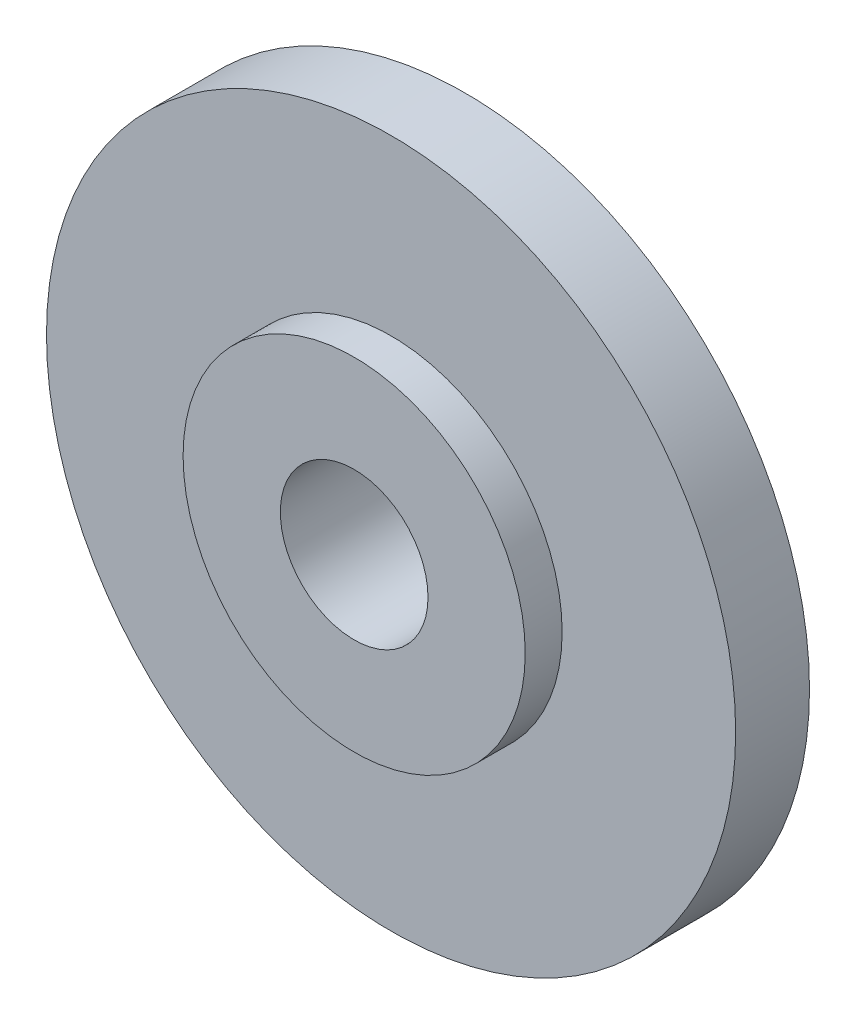
ISO-10303-21;
HEADER;
FILE_DESCRIPTION(('STEP AP214'),'2;1');
FILE_NAME('part.step','',(''),(''),'','','');
FILE_SCHEMA(('AUTOMOTIVE_DESIGN { 1 0 10303 214 1 1 1 1 }'));
ENDSEC;
DATA;
#1=APPLICATION_CONTEXT('core data for automotive mechanical design processes');
#2=APPLICATION_PROTOCOL_DEFINITION('international standard','automotive_design',2000,#1);
#3=PRODUCT_CONTEXT('',#1,'mechanical');
#4=PRODUCT('Part','Part','',(#3));
#5=PRODUCT_RELATED_PRODUCT_CATEGORY('part','',(#4));
#6=PRODUCT_DEFINITION_FORMATION('','',#4);
#7=PRODUCT_DEFINITION_CONTEXT('part definition',#1,'design');
#8=PRODUCT_DEFINITION('design','',#6,#7);
#9=PRODUCT_DEFINITION_SHAPE('','',#8);
#10=(LENGTH_UNIT() NAMED_UNIT(*) SI_UNIT(.MILLI.,.METRE.));
#11=(NAMED_UNIT(*) PLANE_ANGLE_UNIT() SI_UNIT($,.RADIAN.));
#12=(NAMED_UNIT(*) SI_UNIT($,.STERADIAN.) SOLID_ANGLE_UNIT());
#13=UNCERTAINTY_MEASURE_WITH_UNIT(LENGTH_MEASURE(1.E-05),#10,'distance_accuracy_value','');
#14=(GEOMETRIC_REPRESENTATION_CONTEXT(3) GLOBAL_UNCERTAINTY_ASSIGNED_CONTEXT((#13)) GLOBAL_UNIT_ASSIGNED_CONTEXT((#10,
#11,#12)) REPRESENTATION_CONTEXT('',''));
#15=CARTESIAN_POINT('',(0.,0.,0.));
#16=DIRECTION('',(0.,0.,1.));
#17=DIRECTION('',(1.,0.,0.));
#18=AXIS2_PLACEMENT_3D('',#15,#16,#17);
#19=CARTESIAN_POINT('',(0.,0.,3.));
#20=DIRECTION('',(0.,0.,-1.));
#21=DIRECTION('',(-1.,0.,0.));
#22=AXIS2_PLACEMENT_3D('',#19,#20,#21);
#23=CYLINDRICAL_SURFACE('',#22,14.);
#24=CARTESIAN_POINT('',(0.,0.,3.));
#25=DIRECTION('',(0.,0.,1.));
#26=DIRECTION('',(1.,0.,0.));
#27=AXIS2_PLACEMENT_3D('',#24,#25,#26);
#28=CIRCLE('',#27,14.);
#29=CARTESIAN_POINT('',(14.,0.,3.));
#30=VERTEX_POINT('',#29);
#31=EDGE_CURVE('E42',#30,#30,#28,.T.);
#32=ORIENTED_EDGE('',*,*,#31,.F.);
#33=EDGE_LOOP('',(#32));
#34=FACE_BOUND('',#33,.T.);
#35=CARTESIAN_POINT('',(0.,0.,0.));
#36=DIRECTION('',(0.,0.,1.));
#37=DIRECTION('',(1.,0.,0.));
#38=AXIS2_PLACEMENT_3D('',#35,#36,#37);
#39=CIRCLE('',#38,14.);
#40=CARTESIAN_POINT('',(14.,0.,0.));
#41=VERTEX_POINT('',#40);
#42=EDGE_CURVE('E37',#41,#41,#39,.T.);
#43=ORIENTED_EDGE('',*,*,#42,.T.);
#44=EDGE_LOOP('',(#43));
#45=FACE_BOUND('',#44,.T.);
#46=ADVANCED_FACE('F40',(#34,#45),#23,.T.);
#47=CARTESIAN_POINT('',(0.,0.,3.));
#48=DIRECTION('',(0.,0.,1.));
#49=DIRECTION('',(1.,0.,0.));
#50=AXIS2_PLACEMENT_3D('',#47,#48,#49);
#51=PLANE('',#50);
#52=CARTESIAN_POINT('',(0.,0.,3.));
#53=DIRECTION('',(0.,0.,1.));
#54=DIRECTION('',(1.,0.,0.));
#55=AXIS2_PLACEMENT_3D('',#52,#53,#54);
#56=CIRCLE('',#55,6.95);
#57=CARTESIAN_POINT('',(6.95,0.,3.));
#58=VERTEX_POINT('',#57);
#59=EDGE_CURVE('E10',#58,#58,#56,.T.);
#60=ORIENTED_EDGE('',*,*,#59,.F.);
#61=EDGE_LOOP('',(#60));
#62=FACE_BOUND('',#61,.T.);
#63=ORIENTED_EDGE('',*,*,#31,.T.);
#64=EDGE_LOOP('',(#63));
#65=FACE_BOUND('',#64,.T.);
#66=ADVANCED_FACE('F85',(#62,#65),#51,.T.);
#67=CARTESIAN_POINT('',(0.,0.,0.));
#68=DIRECTION('',(0.,0.,1.));
#69=DIRECTION('',(1.,0.,0.));
#70=AXIS2_PLACEMENT_3D('',#67,#68,#69);
#71=PLANE('',#70);
#72=CARTESIAN_POINT('',(0.,0.,0.));
#73=DIRECTION('',(0.,0.,1.));
#74=DIRECTION('',(1.,0.,0.));
#75=AXIS2_PLACEMENT_3D('',#72,#73,#74);
#76=CIRCLE('',#75,3.);
#77=CARTESIAN_POINT('',(3.,0.,0.));
#78=VERTEX_POINT('',#77);
#79=EDGE_CURVE('E52',#78,#78,#76,.T.);
#80=ORIENTED_EDGE('',*,*,#79,.T.);
#81=EDGE_LOOP('',(#80));
#82=FACE_BOUND('',#81,.T.);
#83=ORIENTED_EDGE('',*,*,#42,.F.);
#84=EDGE_LOOP('',(#83));
#85=FACE_BOUND('',#84,.T.);
#86=ADVANCED_FACE('F58',(#82,#85),#71,.F.);
#87=CARTESIAN_POINT('',(0.,0.,4.5));
#88=DIRECTION('',(0.,0.,-1.));
#89=DIRECTION('',(-1.,0.,0.));
#90=AXIS2_PLACEMENT_3D('',#87,#88,#89);
#91=CYLINDRICAL_SURFACE('',#90,6.95);
#92=CARTESIAN_POINT('',(0.,0.,4.5));
#93=DIRECTION('',(0.,0.,1.));
#94=DIRECTION('',(1.,0.,0.));
#95=AXIS2_PLACEMENT_3D('',#92,#93,#94);
#96=CIRCLE('',#95,6.95);
#97=CARTESIAN_POINT('',(6.95,0.,4.5));
#98=VERTEX_POINT('',#97);
#99=EDGE_CURVE('E49',#98,#98,#96,.T.);
#100=ORIENTED_EDGE('',*,*,#99,.F.);
#101=EDGE_LOOP('',(#100));
#102=FACE_BOUND('',#101,.T.);
#103=ORIENTED_EDGE('',*,*,#59,.T.);
#104=EDGE_LOOP('',(#103));
#105=FACE_BOUND('',#104,.T.);
#106=ADVANCED_FACE('F75',(#102,#105),#91,.T.);
#107=CARTESIAN_POINT('',(0.,0.,4.5));
#108=DIRECTION('',(0.,0.,1.));
#109=DIRECTION('',(1.,0.,0.));
#110=AXIS2_PLACEMENT_3D('',#107,#108,#109);
#111=PLANE('',#110);
#112=CARTESIAN_POINT('',(0.,0.,4.5));
#113=DIRECTION('',(0.,0.,1.));
#114=DIRECTION('',(1.,0.,0.));
#115=AXIS2_PLACEMENT_3D('',#112,#113,#114);
#116=CIRCLE('',#115,3.);
#117=CARTESIAN_POINT('',(3.,0.,4.5));
#118=VERTEX_POINT('',#117);
#119=EDGE_CURVE('E53',#118,#118,#116,.T.);
#120=ORIENTED_EDGE('',*,*,#119,.F.);
#121=EDGE_LOOP('',(#120));
#122=FACE_BOUND('',#121,.T.);
#123=ORIENTED_EDGE('',*,*,#99,.T.);
#124=EDGE_LOOP('',(#123));
#125=FACE_BOUND('',#124,.T.);
#126=ADVANCED_FACE('F67',(#122,#125),#111,.T.);
#127=CARTESIAN_POINT('',(0.,0.,0.));
#128=DIRECTION('',(0.,0.,1.));
#129=DIRECTION('',(1.,0.,0.));
#130=AXIS2_PLACEMENT_3D('',#127,#128,#129);
#131=CYLINDRICAL_SURFACE('',#130,3.);
#132=ORIENTED_EDGE('',*,*,#79,.F.);
#133=EDGE_LOOP('',(#132));
#134=FACE_BOUND('',#133,.T.);
#135=ORIENTED_EDGE('',*,*,#119,.T.);
#136=EDGE_LOOP('',(#135));
#137=FACE_BOUND('',#136,.T.);
#138=ADVANCED_FACE('F64',(#134,#137),#131,.F.);
#139=CLOSED_SHELL('',(#46,#66,#86,#106,#126,#138));
#140=MANIFOLD_SOLID_BREP('B2',#139);
#141=ADVANCED_BREP_SHAPE_REPRESENTATION('',(#18,#140),#14);
#142=SHAPE_DEFINITION_REPRESENTATION(#9,#141);
ENDSEC;
END-ISO-10303-21;
